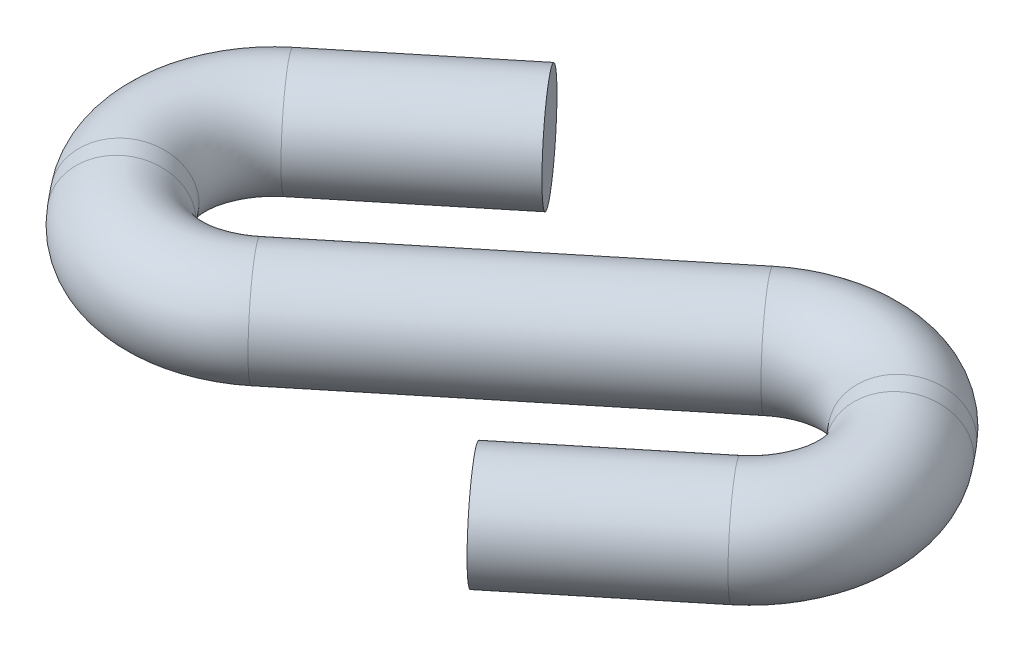
ISO-10303-21;
HEADER;
FILE_DESCRIPTION(('STEP AP214'),'2;1');
FILE_NAME('part.step','',(''),(''),'','','');
FILE_SCHEMA(('AUTOMOTIVE_DESIGN { 1 0 10303 214 1 1 1 1 }'));
ENDSEC;
DATA;
#1=APPLICATION_CONTEXT('core data for automotive mechanical design processes');
#2=APPLICATION_PROTOCOL_DEFINITION('international standard','automotive_design',2000,#1);
#3=PRODUCT_CONTEXT('',#1,'mechanical');
#4=PRODUCT('Part','Part','',(#3));
#5=PRODUCT_RELATED_PRODUCT_CATEGORY('part','',(#4));
#6=PRODUCT_DEFINITION_FORMATION('','',#4);
#7=PRODUCT_DEFINITION_CONTEXT('part definition',#1,'design');
#8=PRODUCT_DEFINITION('design','',#6,#7);
#9=PRODUCT_DEFINITION_SHAPE('','',#8);
#10=(LENGTH_UNIT() NAMED_UNIT(*) SI_UNIT(.MILLI.,.METRE.));
#11=(NAMED_UNIT(*) PLANE_ANGLE_UNIT() SI_UNIT($,.RADIAN.));
#12=(NAMED_UNIT(*) SI_UNIT($,.STERADIAN.) SOLID_ANGLE_UNIT());
#13=UNCERTAINTY_MEASURE_WITH_UNIT(LENGTH_MEASURE(1.E-05),#10,'distance_accuracy_value','');
#14=(GEOMETRIC_REPRESENTATION_CONTEXT(3) GLOBAL_UNCERTAINTY_ASSIGNED_CONTEXT((#13)) GLOBAL_UNIT_ASSIGNED_CONTEXT((#10,
#11,#12)) REPRESENTATION_CONTEXT('',''));
#15=CARTESIAN_POINT('',(0.,0.,0.));
#16=DIRECTION('',(0.,0.,1.));
#17=DIRECTION('',(1.,0.,0.));
#18=AXIS2_PLACEMENT_3D('',#15,#16,#17);
#19=CARTESIAN_POINT('',(1.36873472747402,0.,1.7226382223249));
#20=DIRECTION('',(-0.774306065828726,0.,0.632811280257267));
#21=DIRECTION('',(0.632811280257267,0.,0.774306065828726));
#22=AXIS2_PLACEMENT_3D('',#19,#20,#21);
#23=PLANE('',#22);
#24=CARTESIAN_POINT('',(1.36873472747402,0.,1.7226382223249));
#25=DIRECTION('',(-0.774306065828726,0.,0.632811280257267));
#26=DIRECTION('',(0.632811280257267,0.,0.774306065828726));
#27=AXIS2_PLACEMENT_3D('',#24,#25,#26);
#28=CIRCLE('',#27,0.5);
#29=CARTESIAN_POINT('',(1.68514036760265,0.,2.10979125523926));
#30=VERTEX_POINT('',#29);
#31=EDGE_CURVE('E98',#30,#30,#28,.T.);
#32=ORIENTED_EDGE('',*,*,#31,.T.);
#33=EDGE_LOOP('',(#32));
#34=FACE_BOUND('',#33,.T.);
#35=ADVANCED_FACE('F55',(#34),#23,.T.);
#36=CARTESIAN_POINT('',(-1.36873472747403,0.,-1.7226382223249));
#37=DIRECTION('',(-0.774306065828726,0.,0.632811280257267));
#38=DIRECTION('',(0.632811280257267,0.,0.774306065828726));
#39=AXIS2_PLACEMENT_3D('',#36,#37,#38);
#40=PLANE('',#39);
#41=CARTESIAN_POINT('',(-1.36873472747403,0.,-1.7226382223249));
#42=DIRECTION('',(-0.774306065828726,0.,0.632811280257267));
#43=DIRECTION('',(0.632811280257267,0.,0.774306065828726));
#44=AXIS2_PLACEMENT_3D('',#41,#42,#43);
#45=CIRCLE('',#44,0.5);
#46=CARTESIAN_POINT('',(-1.05232908734539,0.,-1.33548518941054));
#47=VERTEX_POINT('',#46);
#48=EDGE_CURVE('E11',#47,#47,#45,.T.);
#49=ORIENTED_EDGE('',*,*,#48,.F.);
#50=EDGE_LOOP('',(#49));
#51=FACE_BOUND('',#50,.T.);
#52=ADVANCED_FACE('F107',(#51),#40,.F.);
#53=CARTESIAN_POINT('',(1.36873472747402,0.,1.7226382223249));
#54=DIRECTION('',(0.774306065828726,0.,-0.632811280257266));
#55=DIRECTION('',(-0.632811280257266,0.,-0.774306065828726));
#56=AXIS2_PLACEMENT_3D('',#53,#54,#55);
#57=CYLINDRICAL_SURFACE('',#56,0.5);
#58=CARTESIAN_POINT('',(2.72569393417127,0.,0.613646402755566));
#59=DIRECTION('',(-0.774306065828726,0.,0.632811280257267));
#60=DIRECTION('',(0.632811280257267,0.,0.774306065828726));
#61=AXIS2_PLACEMENT_3D('',#58,#59,#60);
#62=CIRCLE('',#61,0.5);
#63=CARTESIAN_POINT('',(3.0420995742999,0.,1.00079943566993));
#64=VERTEX_POINT('',#63);
#65=EDGE_CURVE('E94',#64,#64,#62,.T.);
#66=ORIENTED_EDGE('',*,*,#65,.T.);
#67=EDGE_LOOP('',(#66));
#68=FACE_BOUND('',#67,.T.);
#69=ORIENTED_EDGE('',*,*,#31,.F.);
#70=EDGE_LOOP('',(#69));
#71=FACE_BOUND('',#70,.T.);
#72=ADVANCED_FACE('F104',(#68,#71),#57,.T.);
#73=CARTESIAN_POINT('',(2.09288265391401,0.,-0.160659663073161));
#74=DIRECTION('',(0.,1.,0.));
#75=DIRECTION('',(0.,0.,1.));
#76=AXIS2_PLACEMENT_3D('',#73,#74,#75);
#77=TOROIDAL_SURFACE('',#76,1.,0.5);
#78=CARTESIAN_POINT('',(2.86718871974273,0.,-0.793470943330427));
#79=DIRECTION('',(0.632811280257267,0.,0.774306065828726));
#80=DIRECTION('',(0.774306065828726,0.,-0.632811280257267));
#81=AXIS2_PLACEMENT_3D('',#78,#79,#80);
#82=CIRCLE('',#81,0.5);
#83=CARTESIAN_POINT('',(3.2543417526571,0.,-1.10987658345906));
#84=VERTEX_POINT('',#83);
#85=EDGE_CURVE('E90',#84,#84,#82,.T.);
#86=CARTESIAN_POINT('',(2.09288265391401,0.,-0.160659663073161));
#87=DIRECTION('',(0.,1.,0.));
#88=DIRECTION('',(0.,0.,1.));
#89=AXIS2_PLACEMENT_3D('',#86,#87,#88);
#90=CIRCLE('',#89,1.5);
#91=EDGE_CURVE('',#64,#84,#90,.T.);
#92=ORIENTED_EDGE('',*,*,#65,.F.);
#93=ORIENTED_EDGE('',*,*,#85,.T.);
#94=ORIENTED_EDGE('',*,*,#91,.T.);
#95=ORIENTED_EDGE('',*,*,#91,.F.);
#96=EDGE_LOOP('',(#92,#94,#93,#95));
#97=FACE_BOUND('',#96,.T.);
#98=ADVANCED_FACE('F106',(#97),#77,.T.);
#99=CARTESIAN_POINT('',(2.86718871974273,0.,-0.793470943330428));
#100=DIRECTION('',(-0.632811280257266,0.,-0.774306065828726));
#101=DIRECTION('',(-0.774306065828726,0.,0.632811280257266));
#102=AXIS2_PLACEMENT_3D('',#99,#100,#101);
#103=CYLINDRICAL_SURFACE('',#102,0.5);
#104=CARTESIAN_POINT('',(2.74062646369128,0.,-0.948332156496173));
#105=DIRECTION('',(0.632811280257266,0.,0.774306065828726));
#106=DIRECTION('',(0.774306065828726,0.,-0.632811280257266));
#107=AXIS2_PLACEMENT_3D('',#104,#105,#106);
#108=CIRCLE('',#107,0.5);
#109=CARTESIAN_POINT('',(3.12777949660564,0.,-1.26473779662481));
#110=VERTEX_POINT('',#109);
#111=EDGE_CURVE('E86',#110,#110,#108,.T.);
#112=ORIENTED_EDGE('',*,*,#111,.T.);
#113=EDGE_LOOP('',(#112));
#114=FACE_BOUND('',#113,.T.);
#115=ORIENTED_EDGE('',*,*,#85,.F.);
#116=EDGE_LOOP('',(#115));
#117=FACE_BOUND('',#116,.T.);
#118=ADVANCED_FACE('F114',(#114,#117),#103,.T.);
#119=CARTESIAN_POINT('',(1.96632039786255,0.,-0.315520876238906));
#120=DIRECTION('',(0.,1.,0.));
#121=DIRECTION('',(0.,0.,1.));
#122=AXIS2_PLACEMENT_3D('',#119,#120,#121);
#123=TOROIDAL_SURFACE('',#122,1.,0.5);
#124=CARTESIAN_POINT('',(1.33350911760529,0.,-1.08982694206763));
#125=DIRECTION('',(0.774306065828726,0.,-0.632811280257267));
#126=DIRECTION('',(-0.632811280257267,0.,-0.774306065828726));
#127=AXIS2_PLACEMENT_3D('',#124,#125,#126);
#128=CIRCLE('',#127,0.5);
#129=CARTESIAN_POINT('',(1.01710347747665,0.,-1.476979974982));
#130=VERTEX_POINT('',#129);
#131=EDGE_CURVE('E82',#130,#130,#128,.T.);
#132=CARTESIAN_POINT('',(1.96632039786255,0.,-0.315520876238906));
#133=DIRECTION('',(0.,1.,0.));
#134=DIRECTION('',(0.,0.,1.));
#135=AXIS2_PLACEMENT_3D('',#132,#133,#134);
#136=CIRCLE('',#135,1.5);
#137=EDGE_CURVE('',#110,#130,#136,.T.);
#138=ORIENTED_EDGE('',*,*,#111,.F.);
#139=ORIENTED_EDGE('',*,*,#131,.T.);
#140=ORIENTED_EDGE('',*,*,#137,.T.);
#141=ORIENTED_EDGE('',*,*,#137,.F.);
#142=EDGE_LOOP('',(#138,#140,#139,#141));
#143=FACE_BOUND('',#142,.T.);
#144=ADVANCED_FACE('F139',(#143),#123,.T.);
#145=CARTESIAN_POINT('',(1.33350911760529,0.,-1.08982694206763));
#146=DIRECTION('',(-0.774306065828726,0.,0.632811280257267));
#147=DIRECTION('',(0.632811280257267,0.,0.774306065828726));
#148=AXIS2_PLACEMENT_3D('',#145,#146,#147);
#149=CYLINDRICAL_SURFACE('',#148,0.5);
#150=CARTESIAN_POINT('',(-1.33350911760529,0.,1.08982694206763));
#151=DIRECTION('',(0.774306065828726,0.,-0.632811280257267));
#152=DIRECTION('',(-0.632811280257267,0.,-0.774306065828726));
#153=AXIS2_PLACEMENT_3D('',#150,#151,#152);
#154=CIRCLE('',#153,0.5);
#155=CARTESIAN_POINT('',(-1.01710347747665,0.,1.476979974982));
#156=VERTEX_POINT('',#155);
#157=EDGE_CURVE('E78',#156,#156,#154,.T.);
#158=ORIENTED_EDGE('',*,*,#157,.T.);
#159=EDGE_LOOP('',(#158));
#160=FACE_BOUND('',#159,.T.);
#161=ORIENTED_EDGE('',*,*,#131,.F.);
#162=EDGE_LOOP('',(#161));
#163=FACE_BOUND('',#162,.T.);
#164=ADVANCED_FACE('F135',(#160,#163),#149,.T.);
#165=CARTESIAN_POINT('',(-1.96632039786255,0.,0.315520876238906));
#166=DIRECTION('',(0.,-1.,0.));
#167=DIRECTION('',(0.,0.,-1.));
#168=AXIS2_PLACEMENT_3D('',#165,#166,#167);
#169=TOROIDAL_SURFACE('',#168,1.,0.5);
#170=CARTESIAN_POINT('',(-2.74062646369128,0.,0.948332156496174));
#171=DIRECTION('',(0.632811280257267,0.,0.774306065828725));
#172=DIRECTION('',(0.774306065828726,0.,-0.632811280257267));
#173=AXIS2_PLACEMENT_3D('',#170,#171,#172);
#174=CIRCLE('',#173,0.5);
#175=CARTESIAN_POINT('',(-3.12777949660564,0.,1.26473779662481));
#176=VERTEX_POINT('',#175);
#177=EDGE_CURVE('E72',#176,#176,#174,.T.);
#178=CARTESIAN_POINT('',(-1.96632039786255,0.,0.315520876238906));
#179=DIRECTION('',(0.,-1.,0.));
#180=DIRECTION('',(0.,0.,-1.));
#181=AXIS2_PLACEMENT_3D('',#178,#179,#180);
#182=CIRCLE('',#181,1.5);
#183=EDGE_CURVE('',#156,#176,#182,.T.);
#184=ORIENTED_EDGE('',*,*,#157,.F.);
#185=ORIENTED_EDGE('',*,*,#177,.T.);
#186=ORIENTED_EDGE('',*,*,#183,.T.);
#187=ORIENTED_EDGE('',*,*,#183,.F.);
#188=EDGE_LOOP('',(#184,#186,#185,#187));
#189=FACE_BOUND('',#188,.T.);
#190=ADVANCED_FACE('F131',(#189),#169,.T.);
#191=CARTESIAN_POINT('',(-2.74062646369128,0.,0.948332156496173));
#192=DIRECTION('',(-0.632811280257266,0.,-0.774306065828726));
#193=DIRECTION('',(-0.774306065828726,0.,0.632811280257266));
#194=AXIS2_PLACEMENT_3D('',#191,#192,#193);
#195=CYLINDRICAL_SURFACE('',#194,0.5);
#196=CARTESIAN_POINT('',(-2.86718871974273,0.,0.793470943330427));
#197=DIRECTION('',(0.632811280257267,0.,0.774306065828726));
#198=DIRECTION('',(0.774306065828726,0.,-0.632811280257267));
#199=AXIS2_PLACEMENT_3D('',#196,#197,#198);
#200=CIRCLE('',#199,0.5);
#201=CARTESIAN_POINT('',(-3.2543417526571,0.,1.10987658345906));
#202=VERTEX_POINT('',#201);
#203=EDGE_CURVE('E67',#202,#202,#200,.T.);
#204=ORIENTED_EDGE('',*,*,#203,.T.);
#205=EDGE_LOOP('',(#204));
#206=FACE_BOUND('',#205,.T.);
#207=ORIENTED_EDGE('',*,*,#177,.F.);
#208=EDGE_LOOP('',(#207));
#209=FACE_BOUND('',#208,.T.);
#210=ADVANCED_FACE('F125',(#206,#209),#195,.T.);
#211=CARTESIAN_POINT('',(-2.09288265391401,0.,0.16065966307316));
#212=DIRECTION('',(0.,-1.,0.));
#213=DIRECTION('',(0.,0.,-1.));
#214=AXIS2_PLACEMENT_3D('',#211,#212,#213);
#215=TOROIDAL_SURFACE('',#214,1.,0.5);
#216=CARTESIAN_POINT('',(-2.72569393417127,0.,-0.613646402755566));
#217=DIRECTION('',(-0.774306065828726,0.,0.632811280257267));
#218=DIRECTION('',(0.632811280257267,0.,0.774306065828726));
#219=AXIS2_PLACEMENT_3D('',#216,#217,#218);
#220=CIRCLE('',#219,0.5);
#221=CARTESIAN_POINT('',(-3.04209957429991,0.,-1.00079943566993));
#222=VERTEX_POINT('',#221);
#223=EDGE_CURVE('E62',#222,#222,#220,.T.);
#224=CARTESIAN_POINT('',(-2.09288265391401,0.,0.16065966307316));
#225=DIRECTION('',(0.,-1.,0.));
#226=DIRECTION('',(0.,0.,-1.));
#227=AXIS2_PLACEMENT_3D('',#224,#225,#226);
#228=CIRCLE('',#227,1.5);
#229=EDGE_CURVE('',#202,#222,#228,.T.);
#230=ORIENTED_EDGE('',*,*,#203,.F.);
#231=ORIENTED_EDGE('',*,*,#223,.T.);
#232=ORIENTED_EDGE('',*,*,#229,.T.);
#233=ORIENTED_EDGE('',*,*,#229,.F.);
#234=EDGE_LOOP('',(#230,#232,#231,#233));
#235=FACE_BOUND('',#234,.T.);
#236=ADVANCED_FACE('F120',(#235),#215,.T.);
#237=CARTESIAN_POINT('',(-2.72569393417127,0.,-0.613646402755565));
#238=DIRECTION('',(0.774306065828726,0.,-0.632811280257267));
#239=DIRECTION('',(-0.632811280257267,0.,-0.774306065828726));
#240=AXIS2_PLACEMENT_3D('',#237,#238,#239);
#241=CYLINDRICAL_SURFACE('',#240,0.5);
#242=ORIENTED_EDGE('',*,*,#48,.T.);
#243=EDGE_LOOP('',(#242));
#244=FACE_BOUND('',#243,.T.);
#245=ORIENTED_EDGE('',*,*,#223,.F.);
#246=EDGE_LOOP('',(#245));
#247=FACE_BOUND('',#246,.T.);
#248=ADVANCED_FACE('F118',(#244,#247),#241,.T.);
#249=CLOSED_SHELL('',(#35,#52,#72,#98,#118,#144,#164,#190,#210,#236,#248));
#250=MANIFOLD_SOLID_BREP('B2',#249);
#251=ADVANCED_BREP_SHAPE_REPRESENTATION('',(#18,#250),#14);
#252=SHAPE_DEFINITION_REPRESENTATION(#9,#251);
ENDSEC;
END-ISO-10303-21;
